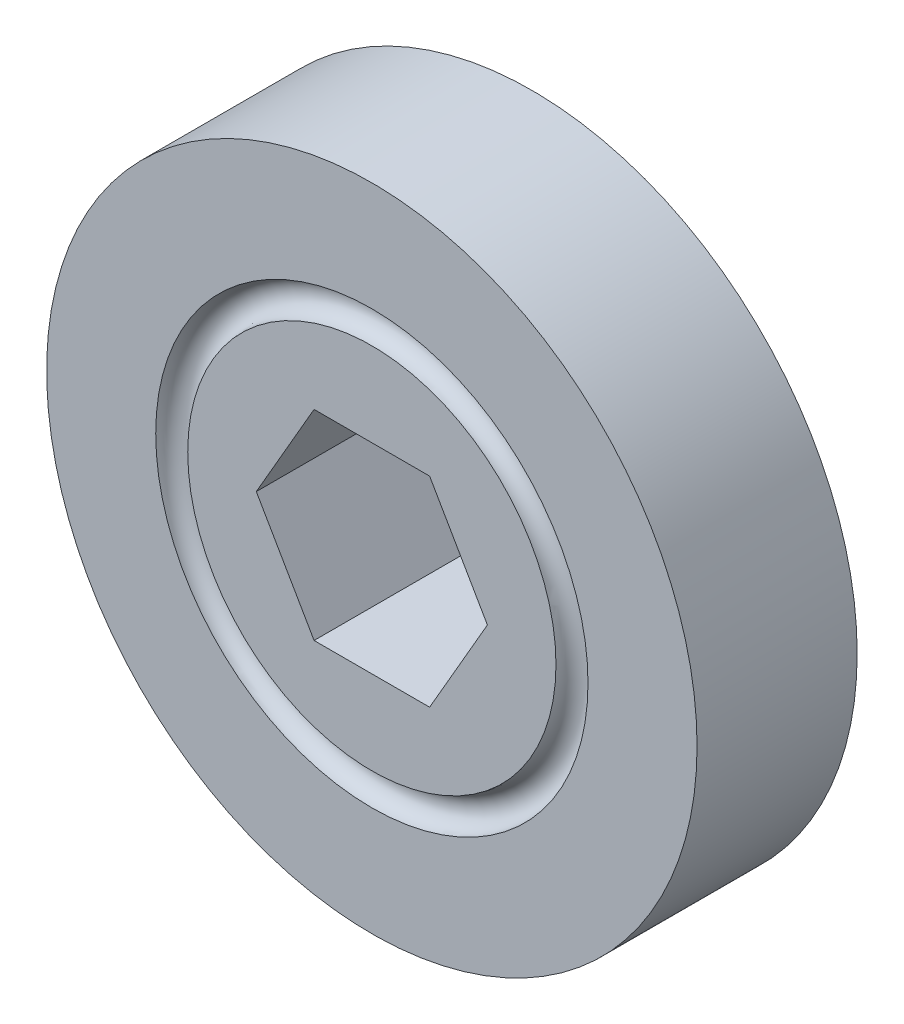
ISO-10303-21;
HEADER;
FILE_DESCRIPTION(('STEP AP214'),'2;1');
FILE_NAME('part.step','',(''),(''),'','','');
FILE_SCHEMA(('AUTOMOTIVE_DESIGN { 1 0 10303 214 1 1 1 1 }'));
ENDSEC;
DATA;
#1=APPLICATION_CONTEXT('core data for automotive mechanical design processes');
#2=APPLICATION_PROTOCOL_DEFINITION('international standard','automotive_design',2000,#1);
#3=PRODUCT_CONTEXT('',#1,'mechanical');
#4=PRODUCT('Part','Part','',(#3));
#5=PRODUCT_RELATED_PRODUCT_CATEGORY('part','',(#4));
#6=PRODUCT_DEFINITION_FORMATION('','',#4);
#7=PRODUCT_DEFINITION_CONTEXT('part definition',#1,'design');
#8=PRODUCT_DEFINITION('design','',#6,#7);
#9=PRODUCT_DEFINITION_SHAPE('','',#8);
#10=(LENGTH_UNIT() NAMED_UNIT(*) SI_UNIT(.MILLI.,.METRE.));
#11=(NAMED_UNIT(*) PLANE_ANGLE_UNIT() SI_UNIT($,.RADIAN.));
#12=(NAMED_UNIT(*) SI_UNIT($,.STERADIAN.) SOLID_ANGLE_UNIT());
#13=UNCERTAINTY_MEASURE_WITH_UNIT(LENGTH_MEASURE(1.E-05),#10,'distance_accuracy_value','');
#14=(GEOMETRIC_REPRESENTATION_CONTEXT(3) GLOBAL_UNCERTAINTY_ASSIGNED_CONTEXT((#13)) GLOBAL_UNIT_ASSIGNED_CONTEXT((#10,
#11,#12)) REPRESENTATION_CONTEXT('',''));
#15=CARTESIAN_POINT('',(0.,0.,0.));
#16=DIRECTION('',(0.,0.,1.));
#17=DIRECTION('',(1.,0.,0.));
#18=AXIS2_PLACEMENT_3D('',#15,#16,#17);
#19=CARTESIAN_POINT('',(0.,20.6375,-5.08));
#20=DIRECTION('',(0.,0.,1.));
#21=DIRECTION('',(1.,0.,0.));
#22=AXIS2_PLACEMENT_3D('',#19,#20,#21);
#23=PLANE('',#22);
#24=CARTESIAN_POINT('',(0.,0.,-5.08));
#25=DIRECTION('',(0.,0.,1.));
#26=DIRECTION('',(1.,0.,0.));
#27=AXIS2_PLACEMENT_3D('',#24,#25,#26);
#28=CIRCLE('',#27,20.6375);
#29=CARTESIAN_POINT('',(20.6375,0.,-5.08));
#30=VERTEX_POINT('',#29);
#31=EDGE_CURVE('E11',#30,#30,#28,.T.);
#32=ORIENTED_EDGE('',*,*,#31,.F.);
#33=EDGE_LOOP('',(#32));
#34=FACE_BOUND('',#33,.T.);
#35=CARTESIAN_POINT('',(0.,0.,-5.08));
#36=DIRECTION('',(0.,0.,1.));
#37=DIRECTION('',(1.,0.,0.));
#38=AXIS2_PLACEMENT_3D('',#35,#36,#37);
#39=CIRCLE('',#38,13.716);
#40=CARTESIAN_POINT('',(13.716,0.,-5.08));
#41=VERTEX_POINT('',#40);
#42=EDGE_CURVE('E99',#41,#41,#39,.T.);
#43=ORIENTED_EDGE('',*,*,#42,.T.);
#44=EDGE_LOOP('',(#43));
#45=FACE_BOUND('',#44,.T.);
#46=ADVANCED_FACE('F33',(#34,#45),#23,.F.);
#47=CARTESIAN_POINT('',(0.,0.,5.08));
#48=DIRECTION('',(0.,0.,1.));
#49=DIRECTION('',(1.,0.,0.));
#50=AXIS2_PLACEMENT_3D('',#47,#48,#49);
#51=CYLINDRICAL_SURFACE('',#50,20.6375);
#52=CARTESIAN_POINT('',(0.,0.,5.08));
#53=DIRECTION('',(0.,0.,1.));
#54=DIRECTION('',(1.,0.,0.));
#55=AXIS2_PLACEMENT_3D('',#52,#53,#54);
#56=CIRCLE('',#55,20.6375);
#57=CARTESIAN_POINT('',(20.6375,0.,5.08));
#58=VERTEX_POINT('',#57);
#59=EDGE_CURVE('E40',#58,#58,#56,.T.);
#60=ORIENTED_EDGE('',*,*,#59,.F.);
#61=EDGE_LOOP('',(#60));
#62=FACE_BOUND('',#61,.T.);
#63=ORIENTED_EDGE('',*,*,#31,.T.);
#64=EDGE_LOOP('',(#63));
#65=FACE_BOUND('',#64,.T.);
#66=ADVANCED_FACE('F149',(#62,#65),#51,.T.);
#67=CARTESIAN_POINT('',(0.,20.6375,5.08));
#68=DIRECTION('',(0.,0.,-1.));
#69=DIRECTION('',(-1.,0.,0.));
#70=AXIS2_PLACEMENT_3D('',#67,#68,#69);
#71=PLANE('',#70);
#72=CARTESIAN_POINT('',(0.,0.,5.08));
#73=DIRECTION('',(0.,0.,1.));
#74=DIRECTION('',(1.,0.,0.));
#75=AXIS2_PLACEMENT_3D('',#72,#73,#74);
#76=CIRCLE('',#75,13.716);
#77=CARTESIAN_POINT('',(13.716,0.,5.08));
#78=VERTEX_POINT('',#77);
#79=EDGE_CURVE('E142',#78,#78,#76,.T.);
#80=ORIENTED_EDGE('',*,*,#79,.F.);
#81=EDGE_LOOP('',(#80));
#82=FACE_BOUND('',#81,.T.);
#83=ORIENTED_EDGE('',*,*,#59,.T.);
#84=EDGE_LOOP('',(#83));
#85=FACE_BOUND('',#84,.T.);
#86=ADVANCED_FACE('F147',(#82,#85),#71,.F.);
#87=CARTESIAN_POINT('',(0.,0.,5.08000000000001));
#88=DIRECTION('',(0.,0.,1.));
#89=DIRECTION('',(1.,0.,0.));
#90=AXIS2_PLACEMENT_3D('',#87,#88,#89);
#91=TOROIDAL_SURFACE('',#90,12.7,1.016);
#92=CARTESIAN_POINT('',(0.,0.,5.08));
#93=DIRECTION('',(0.,0.,1.));
#94=DIRECTION('',(1.,0.,0.));
#95=AXIS2_PLACEMENT_3D('',#92,#93,#94);
#96=CIRCLE('',#95,11.684);
#97=CARTESIAN_POINT('',(11.684,0.,5.08));
#98=VERTEX_POINT('',#97);
#99=EDGE_CURVE('E139',#98,#98,#96,.T.);
#100=ORIENTED_EDGE('',*,*,#99,.F.);
#101=EDGE_LOOP('',(#100));
#102=FACE_BOUND('',#101,.T.);
#103=ORIENTED_EDGE('',*,*,#79,.T.);
#104=EDGE_LOOP('',(#103));
#105=FACE_BOUND('',#104,.T.);
#106=ADVANCED_FACE('F169',(#102,#105),#91,.F.);
#107=CARTESIAN_POINT('',(0.,11.684,5.08));
#108=DIRECTION('',(0.,0.,-1.));
#109=DIRECTION('',(-1.,0.,0.));
#110=AXIS2_PLACEMENT_3D('',#107,#108,#109);
#111=PLANE('',#110);
#112=DIRECTION('',(-0.5,-0.866025403784439,0.));
#113=VECTOR('',#112,1.);
#114=CARTESIAN_POINT('',(-3.66617420935412,6.35,5.08));
#115=LINE('',#114,#113);
#116=CARTESIAN_POINT('',(-3.66617420935412,6.35,5.08));
#117=VERTEX_POINT('',#116);
#118=CARTESIAN_POINT('',(-7.33234841870825,0.,5.08));
#119=VERTEX_POINT('',#118);
#120=EDGE_CURVE('E108',#117,#119,#115,.T.);
#121=ORIENTED_EDGE('',*,*,#120,.F.);
#122=DIRECTION('',(-1.,0.,0.));
#123=VECTOR('',#122,1.);
#124=CARTESIAN_POINT('',(3.66617420935412,6.35,5.08));
#125=LINE('',#124,#123);
#126=CARTESIAN_POINT('',(3.66617420935412,6.35,5.08));
#127=VERTEX_POINT('',#126);
#128=EDGE_CURVE('E47',#127,#117,#125,.T.);
#129=ORIENTED_EDGE('',*,*,#128,.F.);
#130=DIRECTION('',(-0.5,0.866025403784439,0.));
#131=VECTOR('',#130,1.);
#132=CARTESIAN_POINT('',(7.33234841870825,0.,5.08));
#133=LINE('',#132,#131);
#134=CARTESIAN_POINT('',(7.33234841870825,0.,5.08));
#135=VERTEX_POINT('',#134);
#136=EDGE_CURVE('E93',#135,#127,#133,.T.);
#137=ORIENTED_EDGE('',*,*,#136,.F.);
#138=DIRECTION('',(0.5,0.866025403784439,0.));
#139=VECTOR('',#138,1.);
#140=CARTESIAN_POINT('',(3.66617420935412,-6.35,5.08));
#141=LINE('',#140,#139);
#142=CARTESIAN_POINT('',(3.66617420935412,-6.35,5.08));
#143=VERTEX_POINT('',#142);
#144=EDGE_CURVE('E121',#143,#135,#141,.T.);
#145=ORIENTED_EDGE('',*,*,#144,.F.);
#146=DIRECTION('',(1.,0.,0.));
#147=VECTOR('',#146,1.);
#148=CARTESIAN_POINT('',(-3.66617420935413,-6.35,5.08));
#149=LINE('',#148,#147);
#150=CARTESIAN_POINT('',(-3.66617420935413,-6.35,5.08));
#151=VERTEX_POINT('',#150);
#152=EDGE_CURVE('E118',#151,#143,#149,.T.);
#153=ORIENTED_EDGE('',*,*,#152,.F.);
#154=DIRECTION('',(0.5,-0.866025403784439,0.));
#155=VECTOR('',#154,1.);
#156=CARTESIAN_POINT('',(-7.33234841870825,0.,5.08));
#157=LINE('',#156,#155);
#158=EDGE_CURVE('E115',#119,#151,#157,.T.);
#159=ORIENTED_EDGE('',*,*,#158,.F.);
#160=EDGE_LOOP('',(#121,#129,#137,#145,#153,#159));
#161=FACE_BOUND('',#160,.T.);
#162=ORIENTED_EDGE('',*,*,#99,.T.);
#163=EDGE_LOOP('',(#162));
#164=FACE_BOUND('',#163,.T.);
#165=ADVANCED_FACE('F164',(#161,#164),#111,.F.);
#166=CARTESIAN_POINT('',(0.,11.684,-5.08));
#167=DIRECTION('',(0.,0.,1.));
#168=DIRECTION('',(1.,0.,0.));
#169=AXIS2_PLACEMENT_3D('',#166,#167,#168);
#170=PLANE('',#169);
#171=DIRECTION('',(0.5,-0.866025403784439,0.));
#172=VECTOR('',#171,1.);
#173=CARTESIAN_POINT('',(7.33234841870825,0.,-5.08));
#174=LINE('',#173,#172);
#175=CARTESIAN_POINT('',(3.66617420935412,6.35,-5.08));
#176=VERTEX_POINT('',#175);
#177=CARTESIAN_POINT('',(7.33234841870825,0.,-5.08));
#178=VERTEX_POINT('',#177);
#179=EDGE_CURVE('E106',#176,#178,#174,.T.);
#180=ORIENTED_EDGE('',*,*,#179,.F.);
#181=DIRECTION('',(1.,0.,0.));
#182=VECTOR('',#181,1.);
#183=CARTESIAN_POINT('',(3.66617420935412,6.35,-5.08));
#184=LINE('',#183,#182);
#185=CARTESIAN_POINT('',(-3.66617420935412,6.35,-5.08));
#186=VERTEX_POINT('',#185);
#187=EDGE_CURVE('E87',#186,#176,#184,.T.);
#188=ORIENTED_EDGE('',*,*,#187,.F.);
#189=DIRECTION('',(0.5,0.866025403784439,0.));
#190=VECTOR('',#189,1.);
#191=CARTESIAN_POINT('',(-3.66617420935412,6.35,-5.08));
#192=LINE('',#191,#190);
#193=CARTESIAN_POINT('',(-7.33234841870825,0.,-5.08));
#194=VERTEX_POINT('',#193);
#195=EDGE_CURVE('E96',#194,#186,#192,.T.);
#196=ORIENTED_EDGE('',*,*,#195,.F.);
#197=DIRECTION('',(-0.5,0.866025403784439,0.));
#198=VECTOR('',#197,1.);
#199=CARTESIAN_POINT('',(-7.33234841870825,0.,-5.08));
#200=LINE('',#199,#198);
#201=CARTESIAN_POINT('',(-3.66617420935413,-6.35,-5.08));
#202=VERTEX_POINT('',#201);
#203=EDGE_CURVE('E55',#202,#194,#200,.T.);
#204=ORIENTED_EDGE('',*,*,#203,.F.);
#205=DIRECTION('',(-1.,0.,0.));
#206=VECTOR('',#205,1.);
#207=CARTESIAN_POINT('',(-3.66617420935413,-6.35,-5.08));
#208=LINE('',#207,#206);
#209=CARTESIAN_POINT('',(3.66617420935412,-6.35,-5.08));
#210=VERTEX_POINT('',#209);
#211=EDGE_CURVE('E260',#210,#202,#208,.T.);
#212=ORIENTED_EDGE('',*,*,#211,.F.);
#213=DIRECTION('',(-0.5,-0.866025403784439,0.));
#214=VECTOR('',#213,1.);
#215=CARTESIAN_POINT('',(3.66617420935412,-6.35,-5.08));
#216=LINE('',#215,#214);
#217=EDGE_CURVE('E110',#178,#210,#216,.T.);
#218=ORIENTED_EDGE('',*,*,#217,.F.);
#219=EDGE_LOOP('',(#180,#188,#196,#204,#212,#218));
#220=FACE_BOUND('',#219,.T.);
#221=CARTESIAN_POINT('',(0.,0.,-5.08));
#222=DIRECTION('',(0.,0.,1.));
#223=DIRECTION('',(1.,0.,0.));
#224=AXIS2_PLACEMENT_3D('',#221,#222,#223);
#225=CIRCLE('',#224,11.684);
#226=CARTESIAN_POINT('',(11.684,0.,-5.08));
#227=VERTEX_POINT('',#226);
#228=EDGE_CURVE('E136',#227,#227,#225,.T.);
#229=ORIENTED_EDGE('',*,*,#228,.F.);
#230=EDGE_LOOP('',(#229));
#231=FACE_BOUND('',#230,.T.);
#232=ADVANCED_FACE('F102',(#220,#231),#170,.F.);
#233=CARTESIAN_POINT('',(0.,0.,-5.08000000000001));
#234=DIRECTION('',(0.,0.,1.));
#235=DIRECTION('',(1.,0.,0.));
#236=AXIS2_PLACEMENT_3D('',#233,#234,#235);
#237=TOROIDAL_SURFACE('',#236,12.7,1.016);
#238=ORIENTED_EDGE('',*,*,#42,.F.);
#239=EDGE_LOOP('',(#238));
#240=FACE_BOUND('',#239,.T.);
#241=ORIENTED_EDGE('',*,*,#228,.T.);
#242=EDGE_LOOP('',(#241));
#243=FACE_BOUND('',#242,.T.);
#244=ADVANCED_FACE('F158',(#240,#243),#237,.F.);
#245=CARTESIAN_POINT('',(3.66617420935412,6.35,-5.081));
#246=DIRECTION('',(0.,1.,0.));
#247=DIRECTION('',(0.,0.,1.));
#248=AXIS2_PLACEMENT_3D('',#245,#246,#247);
#249=PLANE('',#248);
#250=ORIENTED_EDGE('',*,*,#187,.T.);
#251=DIRECTION('',(0.,0.,1.));
#252=VECTOR('',#251,1.);
#253=CARTESIAN_POINT('',(3.66617420935412,6.35,-5.081));
#254=LINE('',#253,#252);
#255=EDGE_CURVE('E100',#176,#127,#254,.T.);
#256=ORIENTED_EDGE('',*,*,#255,.T.);
#257=ORIENTED_EDGE('',*,*,#128,.T.);
#258=DIRECTION('',(0.,0.,1.));
#259=VECTOR('',#258,1.);
#260=CARTESIAN_POINT('',(-3.66617420935412,6.35,-5.081));
#261=LINE('',#260,#259);
#262=EDGE_CURVE('E83',#186,#117,#261,.T.);
#263=ORIENTED_EDGE('',*,*,#262,.F.);
#264=EDGE_LOOP('',(#250,#256,#257,#263));
#265=FACE_BOUND('',#264,.T.);
#266=ADVANCED_FACE('F85',(#265),#249,.F.);
#267=CARTESIAN_POINT('',(7.33234841870825,0.,-5.081));
#268=DIRECTION('',(0.866025403784439,0.5,0.));
#269=DIRECTION('',(-0.5,0.866025403784439,0.));
#270=AXIS2_PLACEMENT_3D('',#267,#268,#269);
#271=PLANE('',#270);
#272=ORIENTED_EDGE('',*,*,#179,.T.);
#273=DIRECTION('',(0.,0.,1.));
#274=VECTOR('',#273,1.);
#275=CARTESIAN_POINT('',(7.33234841870825,0.,-5.081));
#276=LINE('',#275,#274);
#277=EDGE_CURVE('E127',#178,#135,#276,.T.);
#278=ORIENTED_EDGE('',*,*,#277,.T.);
#279=ORIENTED_EDGE('',*,*,#136,.T.);
#280=ORIENTED_EDGE('',*,*,#255,.F.);
#281=EDGE_LOOP('',(#272,#278,#279,#280));
#282=FACE_BOUND('',#281,.T.);
#283=ADVANCED_FACE('F209',(#282),#271,.F.);
#284=CARTESIAN_POINT('',(3.66617420935412,-6.35,-5.081));
#285=DIRECTION('',(0.866025403784438,-0.5,0.));
#286=DIRECTION('',(0.5,0.866025403784439,0.));
#287=AXIS2_PLACEMENT_3D('',#284,#285,#286);
#288=PLANE('',#287);
#289=ORIENTED_EDGE('',*,*,#217,.T.);
#290=DIRECTION('',(0.,0.,1.));
#291=VECTOR('',#290,1.);
#292=CARTESIAN_POINT('',(3.66617420935412,-6.35,-5.081));
#293=LINE('',#292,#291);
#294=EDGE_CURVE('E129',#210,#143,#293,.T.);
#295=ORIENTED_EDGE('',*,*,#294,.T.);
#296=ORIENTED_EDGE('',*,*,#144,.T.);
#297=ORIENTED_EDGE('',*,*,#277,.F.);
#298=EDGE_LOOP('',(#289,#295,#296,#297));
#299=FACE_BOUND('',#298,.T.);
#300=ADVANCED_FACE('F217',(#299),#288,.F.);
#301=CARTESIAN_POINT('',(-3.66617420935413,-6.35,-5.081));
#302=DIRECTION('',(0.,-1.,0.));
#303=DIRECTION('',(0.,0.,-1.));
#304=AXIS2_PLACEMENT_3D('',#301,#302,#303);
#305=PLANE('',#304);
#306=ORIENTED_EDGE('',*,*,#211,.T.);
#307=DIRECTION('',(0.,0.,1.));
#308=VECTOR('',#307,1.);
#309=CARTESIAN_POINT('',(-3.66617420935413,-6.35,-5.081));
#310=LINE('',#309,#308);
#311=EDGE_CURVE('E131',#202,#151,#310,.T.);
#312=ORIENTED_EDGE('',*,*,#311,.T.);
#313=ORIENTED_EDGE('',*,*,#152,.T.);
#314=ORIENTED_EDGE('',*,*,#294,.F.);
#315=EDGE_LOOP('',(#306,#312,#313,#314));
#316=FACE_BOUND('',#315,.T.);
#317=ADVANCED_FACE('F227',(#316),#305,.F.);
#318=CARTESIAN_POINT('',(-7.33234841870825,0.,-5.081));
#319=DIRECTION('',(-0.866025403784439,-0.5,0.));
#320=DIRECTION('',(0.5,-0.866025403784439,0.));
#321=AXIS2_PLACEMENT_3D('',#318,#319,#320);
#322=PLANE('',#321);
#323=ORIENTED_EDGE('',*,*,#203,.T.);
#324=DIRECTION('',(0.,0.,1.));
#325=VECTOR('',#324,1.);
#326=CARTESIAN_POINT('',(-7.33234841870825,0.,-5.081));
#327=LINE('',#326,#325);
#328=EDGE_CURVE('E92',#194,#119,#327,.T.);
#329=ORIENTED_EDGE('',*,*,#328,.T.);
#330=ORIENTED_EDGE('',*,*,#158,.T.);
#331=ORIENTED_EDGE('',*,*,#311,.F.);
#332=EDGE_LOOP('',(#323,#329,#330,#331));
#333=FACE_BOUND('',#332,.T.);
#334=ADVANCED_FACE('F237',(#333),#322,.F.);
#335=CARTESIAN_POINT('',(-3.66617420935412,6.35,-5.081));
#336=DIRECTION('',(-0.866025403784438,0.5,0.));
#337=DIRECTION('',(-0.5,-0.866025403784439,0.));
#338=AXIS2_PLACEMENT_3D('',#335,#336,#337);
#339=PLANE('',#338);
#340=ORIENTED_EDGE('',*,*,#195,.T.);
#341=ORIENTED_EDGE('',*,*,#262,.T.);
#342=ORIENTED_EDGE('',*,*,#120,.T.);
#343=ORIENTED_EDGE('',*,*,#328,.F.);
#344=EDGE_LOOP('',(#340,#341,#342,#343));
#345=FACE_BOUND('',#344,.T.);
#346=ADVANCED_FACE('F97',(#345),#339,.F.);
#347=CLOSED_SHELL('',(#46,#66,#86,#106,#165,#232,#244,#266,#283,#300,#317,#334,#346));
#348=MANIFOLD_SOLID_BREP('B2',#347);
#349=ADVANCED_BREP_SHAPE_REPRESENTATION('',(#18,#348),#14);
#350=SHAPE_DEFINITION_REPRESENTATION(#9,#349);
ENDSEC;
END-ISO-10303-21;
